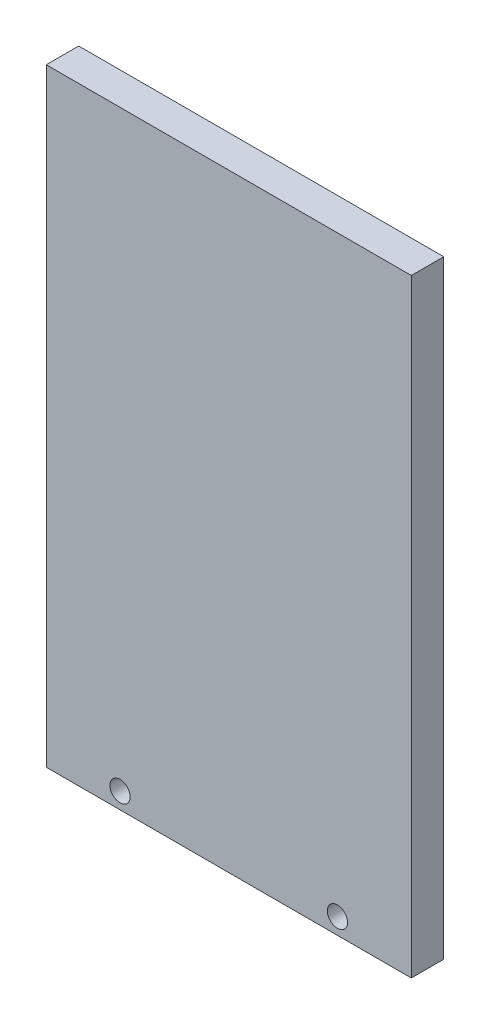
ISO-10303-21;
HEADER;
FILE_DESCRIPTION(('STEP AP214'),'2;1');
FILE_NAME('part.step','',(''),(''),'','','');
FILE_SCHEMA(('AUTOMOTIVE_DESIGN { 1 0 10303 214 1 1 1 1 }'));
ENDSEC;
DATA;
#1=APPLICATION_CONTEXT('core data for automotive mechanical design processes');
#2=APPLICATION_PROTOCOL_DEFINITION('international standard','automotive_design',2000,#1);
#3=PRODUCT_CONTEXT('',#1,'mechanical');
#4=PRODUCT('Part','Part','',(#3));
#5=PRODUCT_RELATED_PRODUCT_CATEGORY('part','',(#4));
#6=PRODUCT_DEFINITION_FORMATION('','',#4);
#7=PRODUCT_DEFINITION_CONTEXT('part definition',#1,'design');
#8=PRODUCT_DEFINITION('design','',#6,#7);
#9=PRODUCT_DEFINITION_SHAPE('','',#8);
#10=(LENGTH_UNIT() NAMED_UNIT(*) SI_UNIT(.MILLI.,.METRE.));
#11=(NAMED_UNIT(*) PLANE_ANGLE_UNIT() SI_UNIT($,.RADIAN.));
#12=(NAMED_UNIT(*) SI_UNIT($,.STERADIAN.) SOLID_ANGLE_UNIT());
#13=UNCERTAINTY_MEASURE_WITH_UNIT(LENGTH_MEASURE(1.E-05),#10,'distance_accuracy_value','');
#14=(GEOMETRIC_REPRESENTATION_CONTEXT(3) GLOBAL_UNCERTAINTY_ASSIGNED_CONTEXT((#13)) GLOBAL_UNIT_ASSIGNED_CONTEXT((#10,
#11,#12)) REPRESENTATION_CONTEXT('',''));
#15=CARTESIAN_POINT('',(0.,0.,0.));
#16=DIRECTION('',(0.,0.,1.));
#17=DIRECTION('',(1.,0.,0.));
#18=AXIS2_PLACEMENT_3D('',#15,#16,#17);
#19=CARTESIAN_POINT('',(0.,0.,4.));
#20=DIRECTION('',(0.,0.,1.));
#21=DIRECTION('',(1.,0.,0.));
#22=AXIS2_PLACEMENT_3D('',#19,#20,#21);
#23=PLANE('',#22);
#24=CARTESIAN_POINT('',(-5.89999999999999,-48.6564534438058,4.));
#25=DIRECTION('',(0.,0.,1.));
#26=DIRECTION('',(1.,0.,0.));
#27=AXIS2_PLACEMENT_3D('',#24,#25,#26);
#28=CIRCLE('',#27,1.25);
#29=CARTESIAN_POINT('',(-4.64999999999999,-48.6564534438058,4.));
#30=VERTEX_POINT('',#29);
#31=EDGE_CURVE('E100',#30,#30,#28,.T.);
#32=ORIENTED_EDGE('',*,*,#31,.F.);
#33=EDGE_LOOP('',(#32));
#34=FACE_BOUND('',#33,.T.);
#35=DIRECTION('',(0.,-1.,0.));
#36=VECTOR('',#35,1.);
#37=CARTESIAN_POINT('',(-15.,24.3435465561942,4.));
#38=LINE('',#37,#36);
#39=CARTESIAN_POINT('',(-15.,24.3435465561942,4.));
#40=VERTEX_POINT('',#39);
#41=CARTESIAN_POINT('',(-15.,-50.6564534438058,4.));
#42=VERTEX_POINT('',#41);
#43=EDGE_CURVE('E85',#40,#42,#38,.T.);
#44=ORIENTED_EDGE('',*,*,#43,.T.);
#45=DIRECTION('',(1.,0.,0.));
#46=VECTOR('',#45,1.);
#47=CARTESIAN_POINT('',(-15.,-50.6564534438058,4.));
#48=LINE('',#47,#46);
#49=CARTESIAN_POINT('',(30.,-50.6564534438058,4.));
#50=VERTEX_POINT('',#49);
#51=EDGE_CURVE('E80',#42,#50,#48,.T.);
#52=ORIENTED_EDGE('',*,*,#51,.T.);
#53=DIRECTION('',(0.,1.,0.));
#54=VECTOR('',#53,1.);
#55=CARTESIAN_POINT('',(30.,24.3435465561942,4.));
#56=LINE('',#55,#54);
#57=CARTESIAN_POINT('',(30.,24.3435465561942,4.));
#58=VERTEX_POINT('',#57);
#59=EDGE_CURVE('E83',#50,#58,#56,.T.);
#60=ORIENTED_EDGE('',*,*,#59,.T.);
#61=DIRECTION('',(-1.,0.,0.));
#62=VECTOR('',#61,1.);
#63=CARTESIAN_POINT('',(-15.,24.3435465561942,4.));
#64=LINE('',#63,#62);
#65=EDGE_CURVE('E50',#58,#40,#64,.T.);
#66=ORIENTED_EDGE('',*,*,#65,.T.);
#67=EDGE_LOOP('',(#44,#52,#60,#66));
#68=FACE_BOUND('',#67,.T.);
#69=CARTESIAN_POINT('',(20.9,-48.6564534438058,4.));
#70=DIRECTION('',(0.,0.,1.));
#71=DIRECTION('',(-1.,0.,0.));
#72=AXIS2_PLACEMENT_3D('',#69,#70,#71);
#73=CIRCLE('',#72,1.25);
#74=CARTESIAN_POINT('',(19.65,-48.6564534438058,4.));
#75=VERTEX_POINT('',#74);
#76=EDGE_CURVE('E115',#75,#75,#73,.T.);
#77=ORIENTED_EDGE('',*,*,#76,.F.);
#78=EDGE_LOOP('',(#77));
#79=FACE_BOUND('',#78,.T.);
#80=ADVANCED_FACE('F33',(#34,#68,#79),#23,.T.);
#81=CARTESIAN_POINT('',(0.,0.,0.));
#82=DIRECTION('',(0.,0.,1.));
#83=DIRECTION('',(1.,0.,0.));
#84=AXIS2_PLACEMENT_3D('',#81,#82,#83);
#85=PLANE('',#84);
#86=DIRECTION('',(0.,-1.,0.));
#87=VECTOR('',#86,1.);
#88=CARTESIAN_POINT('',(-15.,24.3435465561942,0.));
#89=LINE('',#88,#87);
#90=CARTESIAN_POINT('',(-15.,24.3435465561942,0.));
#91=VERTEX_POINT('',#90);
#92=CARTESIAN_POINT('',(-15.,-50.6564534438058,0.));
#93=VERTEX_POINT('',#92);
#94=EDGE_CURVE('E97',#91,#93,#89,.T.);
#95=ORIENTED_EDGE('',*,*,#94,.F.);
#96=DIRECTION('',(-1.,0.,0.));
#97=VECTOR('',#96,1.);
#98=CARTESIAN_POINT('',(-15.,24.3435465561942,0.));
#99=LINE('',#98,#97);
#100=CARTESIAN_POINT('',(30.,24.3435465561942,0.));
#101=VERTEX_POINT('',#100);
#102=EDGE_CURVE('E73',#101,#91,#99,.T.);
#103=ORIENTED_EDGE('',*,*,#102,.F.);
#104=DIRECTION('',(0.,1.,0.));
#105=VECTOR('',#104,1.);
#106=CARTESIAN_POINT('',(30.,24.3435465561942,0.));
#107=LINE('',#106,#105);
#108=CARTESIAN_POINT('',(30.,-50.6564534438058,0.));
#109=VERTEX_POINT('',#108);
#110=EDGE_CURVE('E67',#109,#101,#107,.T.);
#111=ORIENTED_EDGE('',*,*,#110,.F.);
#112=DIRECTION('',(1.,0.,0.));
#113=VECTOR('',#112,1.);
#114=CARTESIAN_POINT('',(-15.,-50.6564534438058,0.));
#115=LINE('',#114,#113);
#116=EDGE_CURVE('E89',#93,#109,#115,.T.);
#117=ORIENTED_EDGE('',*,*,#116,.F.);
#118=EDGE_LOOP('',(#95,#103,#111,#117));
#119=FACE_BOUND('',#118,.T.);
#120=CARTESIAN_POINT('',(-5.89999999999999,-48.6564534438058,0.));
#121=DIRECTION('',(0.,0.,1.));
#122=DIRECTION('',(1.,0.,0.));
#123=AXIS2_PLACEMENT_3D('',#120,#121,#122);
#124=CIRCLE('',#123,1.25);
#125=CARTESIAN_POINT('',(-4.64999999999999,-48.6564534438058,0.));
#126=VERTEX_POINT('',#125);
#127=EDGE_CURVE('E112',#126,#126,#124,.T.);
#128=ORIENTED_EDGE('',*,*,#127,.T.);
#129=EDGE_LOOP('',(#128));
#130=FACE_BOUND('',#129,.T.);
#131=CARTESIAN_POINT('',(20.9,-48.6564534438058,0.));
#132=DIRECTION('',(0.,0.,1.));
#133=DIRECTION('',(-1.,0.,0.));
#134=AXIS2_PLACEMENT_3D('',#131,#132,#133);
#135=CIRCLE('',#134,1.25);
#136=CARTESIAN_POINT('',(19.65,-48.6564534438058,0.));
#137=VERTEX_POINT('',#136);
#138=EDGE_CURVE('E118',#137,#137,#135,.T.);
#139=ORIENTED_EDGE('',*,*,#138,.T.);
#140=EDGE_LOOP('',(#139));
#141=FACE_BOUND('',#140,.T.);
#142=ADVANCED_FACE('F108',(#119,#130,#141),#85,.F.);
#143=CARTESIAN_POINT('',(-15.,24.3435465561942,4.));
#144=DIRECTION('',(1.,0.,0.));
#145=DIRECTION('',(0.,1.,0.));
#146=AXIS2_PLACEMENT_3D('',#143,#144,#145);
#147=PLANE('',#146);
#148=ORIENTED_EDGE('',*,*,#94,.T.);
#149=DIRECTION('',(0.,0.,-1.));
#150=VECTOR('',#149,1.);
#151=CARTESIAN_POINT('',(-15.,-50.6564534438058,4.));
#152=LINE('',#151,#150);
#153=EDGE_CURVE('E11',#42,#93,#152,.T.);
#154=ORIENTED_EDGE('',*,*,#153,.F.);
#155=ORIENTED_EDGE('',*,*,#43,.F.);
#156=DIRECTION('',(0.,0.,-1.));
#157=VECTOR('',#156,1.);
#158=CARTESIAN_POINT('',(-15.,24.3435465561942,4.));
#159=LINE('',#158,#157);
#160=EDGE_CURVE('E93',#40,#91,#159,.T.);
#161=ORIENTED_EDGE('',*,*,#160,.T.);
#162=EDGE_LOOP('',(#148,#154,#155,#161));
#163=FACE_BOUND('',#162,.T.);
#164=ADVANCED_FACE('F35',(#163),#147,.F.);
#165=CARTESIAN_POINT('',(-15.,-50.6564534438058,4.));
#166=DIRECTION('',(0.,1.,0.));
#167=DIRECTION('',(-1.,0.,0.));
#168=AXIS2_PLACEMENT_3D('',#165,#166,#167);
#169=PLANE('',#168);
#170=ORIENTED_EDGE('',*,*,#116,.T.);
#171=DIRECTION('',(0.,0.,-1.));
#172=VECTOR('',#171,1.);
#173=CARTESIAN_POINT('',(30.,-50.6564534438058,4.));
#174=LINE('',#173,#172);
#175=EDGE_CURVE('E42',#50,#109,#174,.T.);
#176=ORIENTED_EDGE('',*,*,#175,.F.);
#177=ORIENTED_EDGE('',*,*,#51,.F.);
#178=ORIENTED_EDGE('',*,*,#153,.T.);
#179=EDGE_LOOP('',(#170,#176,#177,#178));
#180=FACE_BOUND('',#179,.T.);
#181=ADVANCED_FACE('F88',(#180),#169,.F.);
#182=CARTESIAN_POINT('',(30.,24.3435465561942,4.));
#183=DIRECTION('',(-1.,0.,0.));
#184=DIRECTION('',(0.,-1.,0.));
#185=AXIS2_PLACEMENT_3D('',#182,#183,#184);
#186=PLANE('',#185);
#187=ORIENTED_EDGE('',*,*,#110,.T.);
#188=DIRECTION('',(0.,0.,-1.));
#189=VECTOR('',#188,1.);
#190=CARTESIAN_POINT('',(30.,24.3435465561942,4.));
#191=LINE('',#190,#189);
#192=EDGE_CURVE('E90',#58,#101,#191,.T.);
#193=ORIENTED_EDGE('',*,*,#192,.F.);
#194=ORIENTED_EDGE('',*,*,#59,.F.);
#195=ORIENTED_EDGE('',*,*,#175,.T.);
#196=EDGE_LOOP('',(#187,#193,#194,#195));
#197=FACE_BOUND('',#196,.T.);
#198=ADVANCED_FACE('F91',(#197),#186,.F.);
#199=CARTESIAN_POINT('',(-15.,24.3435465561942,4.));
#200=DIRECTION('',(0.,-1.,0.));
#201=DIRECTION('',(1.,0.,0.));
#202=AXIS2_PLACEMENT_3D('',#199,#200,#201);
#203=PLANE('',#202);
#204=ORIENTED_EDGE('',*,*,#102,.T.);
#205=ORIENTED_EDGE('',*,*,#160,.F.);
#206=ORIENTED_EDGE('',*,*,#65,.F.);
#207=ORIENTED_EDGE('',*,*,#192,.T.);
#208=EDGE_LOOP('',(#204,#205,#206,#207));
#209=FACE_BOUND('',#208,.T.);
#210=ADVANCED_FACE('F105',(#209),#203,.F.);
#211=CARTESIAN_POINT('',(-5.89999999999999,-48.6564534438058,4.));
#212=DIRECTION('',(0.,0.,-1.));
#213=DIRECTION('',(-1.,0.,0.));
#214=AXIS2_PLACEMENT_3D('',#211,#212,#213);
#215=CYLINDRICAL_SURFACE('',#214,1.25);
#216=ORIENTED_EDGE('',*,*,#31,.T.);
#217=EDGE_LOOP('',(#216));
#218=FACE_BOUND('',#217,.T.);
#219=ORIENTED_EDGE('',*,*,#127,.F.);
#220=EDGE_LOOP('',(#219));
#221=FACE_BOUND('',#220,.T.);
#222=ADVANCED_FACE('F135',(#218,#221),#215,.F.);
#223=CARTESIAN_POINT('',(20.9,-48.6564534438058,4.));
#224=DIRECTION('',(0.,0.,-1.));
#225=DIRECTION('',(-1.,0.,0.));
#226=AXIS2_PLACEMENT_3D('',#223,#224,#225);
#227=CYLINDRICAL_SURFACE('',#226,1.25);
#228=ORIENTED_EDGE('',*,*,#76,.T.);
#229=EDGE_LOOP('',(#228));
#230=FACE_BOUND('',#229,.T.);
#231=ORIENTED_EDGE('',*,*,#138,.F.);
#232=EDGE_LOOP('',(#231));
#233=FACE_BOUND('',#232,.T.);
#234=ADVANCED_FACE('F124',(#230,#233),#227,.F.);
#235=CLOSED_SHELL('',(#80,#142,#164,#181,#198,#210,#222,#234));
#236=MANIFOLD_SOLID_BREP('B2',#235);
#237=ADVANCED_BREP_SHAPE_REPRESENTATION('',(#18,#236),#14);
#238=SHAPE_DEFINITION_REPRESENTATION(#9,#237);
ENDSEC;
END-ISO-10303-21;
